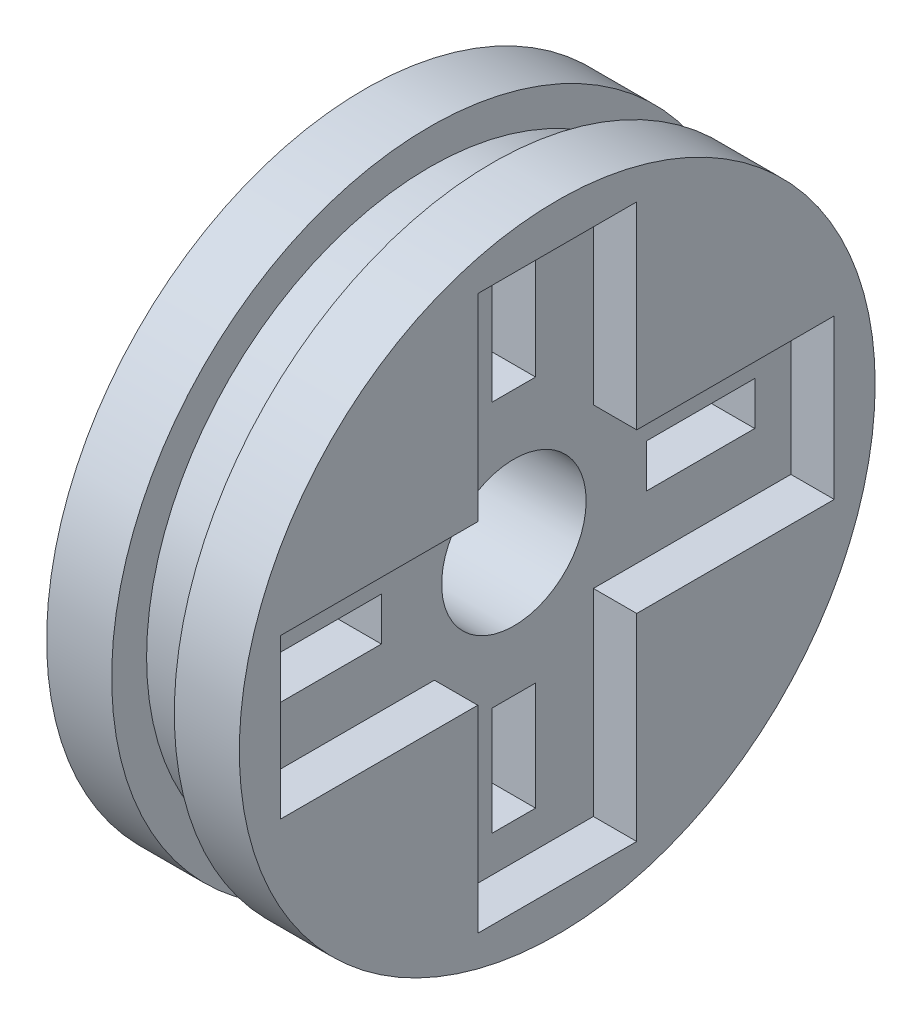
ISO-10303-21;
HEADER;
FILE_DESCRIPTION(('STEP AP214'),'2;1');
FILE_NAME('part.step','',(''),(''),'','','');
FILE_SCHEMA(('AUTOMOTIVE_DESIGN { 1 0 10303 214 1 1 1 1 }'));
ENDSEC;
DATA;
#1=APPLICATION_CONTEXT('core data for automotive mechanical design processes');
#2=APPLICATION_PROTOCOL_DEFINITION('international standard','automotive_design',2000,#1);
#3=PRODUCT_CONTEXT('',#1,'mechanical');
#4=PRODUCT('Part','Part','',(#3));
#5=PRODUCT_RELATED_PRODUCT_CATEGORY('part','',(#4));
#6=PRODUCT_DEFINITION_FORMATION('','',#4);
#7=PRODUCT_DEFINITION_CONTEXT('part definition',#1,'design');
#8=PRODUCT_DEFINITION('design','',#6,#7);
#9=PRODUCT_DEFINITION_SHAPE('','',#8);
#10=(LENGTH_UNIT() NAMED_UNIT(*) SI_UNIT(.MILLI.,.METRE.));
#11=(NAMED_UNIT(*) PLANE_ANGLE_UNIT() SI_UNIT($,.RADIAN.));
#12=(NAMED_UNIT(*) SI_UNIT($,.STERADIAN.) SOLID_ANGLE_UNIT());
#13=UNCERTAINTY_MEASURE_WITH_UNIT(LENGTH_MEASURE(1.E-05),#10,'distance_accuracy_value','');
#14=(GEOMETRIC_REPRESENTATION_CONTEXT(3) GLOBAL_UNCERTAINTY_ASSIGNED_CONTEXT((#13)) GLOBAL_UNIT_ASSIGNED_CONTEXT((#10,
#11,#12)) REPRESENTATION_CONTEXT('',''));
#15=CARTESIAN_POINT('',(0.,0.,0.));
#16=DIRECTION('',(0.,0.,1.));
#17=DIRECTION('',(1.,0.,0.));
#18=AXIS2_PLACEMENT_3D('',#15,#16,#17);
#19=CARTESIAN_POINT('',(-85.2,-65.,66.));
#20=DIRECTION('',(1.,0.,0.));
#21=DIRECTION('',(0.,0.,-1.));
#22=AXIS2_PLACEMENT_3D('',#19,#20,#21);
#23=PLANE('',#22);
#24=CARTESIAN_POINT('',(-85.2,-65.,66.));
#25=DIRECTION('',(1.,0.,0.));
#26=DIRECTION('',(0.,0.,-1.));
#27=AXIS2_PLACEMENT_3D('',#24,#25,#26);
#28=CIRCLE('',#27,3.);
#29=CARTESIAN_POINT('',(-85.2,-65.,63.));
#30=VERTEX_POINT('',#29);
#31=EDGE_CURVE('E463',#30,#30,#28,.F.);
#32=ORIENTED_EDGE('',*,*,#31,.F.);
#33=EDGE_LOOP('',(#32));
#34=FACE_BOUND('',#33,.T.);
#35=DIRECTION('',(0.,1.,0.));
#36=VECTOR('',#35,1.);
#37=CARTESIAN_POINT('',(-85.2,-65.,76.));
#38=LINE('',#37,#36);
#39=CARTESIAN_POINT('',(-85.2,-65.9,76.));
#40=VERTEX_POINT('',#39);
#41=CARTESIAN_POINT('',(-85.2,-64.1,76.));
#42=VERTEX_POINT('',#41);
#43=EDGE_CURVE('E420',#40,#42,#38,.T.);
#44=ORIENTED_EDGE('',*,*,#43,.F.);
#45=DIRECTION('',(0.,0.,1.));
#46=VECTOR('',#45,1.);
#47=CARTESIAN_POINT('',(-85.2,-65.9,66.));
#48=LINE('',#47,#46);
#49=CARTESIAN_POINT('',(-85.2,-65.9,71.5));
#50=VERTEX_POINT('',#49);
#51=EDGE_CURVE('E415',#50,#40,#48,.T.);
#52=ORIENTED_EDGE('',*,*,#51,.F.);
#53=DIRECTION('',(0.,1.,0.));
#54=VECTOR('',#53,1.);
#55=CARTESIAN_POINT('',(-85.2,-65.,71.5));
#56=LINE('',#55,#54);
#57=CARTESIAN_POINT('',(-85.2,-64.1,71.5));
#58=VERTEX_POINT('',#57);
#59=EDGE_CURVE('E422',#50,#58,#56,.T.);
#60=ORIENTED_EDGE('',*,*,#59,.T.);
#61=DIRECTION('',(0.,0.,-1.));
#62=VECTOR('',#61,1.);
#63=CARTESIAN_POINT('',(-85.2,-64.1,66.));
#64=LINE('',#63,#62);
#65=EDGE_CURVE('E417',#42,#58,#64,.T.);
#66=ORIENTED_EDGE('',*,*,#65,.F.);
#67=EDGE_LOOP('',(#44,#52,#60,#66));
#68=FACE_BOUND('',#67,.T.);
#69=DIRECTION('',(0.,1.,0.));
#70=VECTOR('',#69,1.);
#71=CARTESIAN_POINT('',(-85.2,-65.,66.9));
#72=LINE('',#71,#70);
#73=CARTESIAN_POINT('',(-85.2,-59.5,66.9));
#74=VERTEX_POINT('',#73);
#75=CARTESIAN_POINT('',(-85.2,-55.,66.9));
#76=VERTEX_POINT('',#75);
#77=EDGE_CURVE('E342',#74,#76,#72,.T.);
#78=ORIENTED_EDGE('',*,*,#77,.F.);
#79=DIRECTION('',(0.,0.,1.));
#80=VECTOR('',#79,1.);
#81=CARTESIAN_POINT('',(-85.2,-59.5,66.));
#82=LINE('',#81,#80);
#83=CARTESIAN_POINT('',(-85.2,-59.5,65.1));
#84=VERTEX_POINT('',#83);
#85=EDGE_CURVE('E334',#84,#74,#82,.T.);
#86=ORIENTED_EDGE('',*,*,#85,.F.);
#87=DIRECTION('',(0.,1.,0.));
#88=VECTOR('',#87,1.);
#89=CARTESIAN_POINT('',(-85.2,-65.,65.1));
#90=LINE('',#89,#88);
#91=CARTESIAN_POINT('',(-85.2,-55.,65.1));
#92=VERTEX_POINT('',#91);
#93=EDGE_CURVE('E344',#84,#92,#90,.T.);
#94=ORIENTED_EDGE('',*,*,#93,.T.);
#95=DIRECTION('',(0.,0.,-1.));
#96=VECTOR('',#95,1.);
#97=CARTESIAN_POINT('',(-85.2,-55.,66.));
#98=LINE('',#97,#96);
#99=EDGE_CURVE('E339',#76,#92,#98,.T.);
#100=ORIENTED_EDGE('',*,*,#99,.F.);
#101=EDGE_LOOP('',(#78,#86,#94,#100));
#102=FACE_BOUND('',#101,.T.);
#103=CARTESIAN_POINT('',(-85.2,-65.,66.));
#104=DIRECTION('',(1.,0.,0.));
#105=DIRECTION('',(0.,0.,-1.));
#106=AXIS2_PLACEMENT_3D('',#103,#104,#105);
#107=CIRCLE('',#106,13.2);
#108=CARTESIAN_POINT('',(-85.2,-65.,52.8));
#109=VERTEX_POINT('',#108);
#110=EDGE_CURVE('E306',#109,#109,#107,.T.);
#111=ORIENTED_EDGE('',*,*,#110,.F.);
#112=EDGE_LOOP('',(#111));
#113=FACE_BOUND('',#112,.T.);
#114=DIRECTION('',(0.,1.,0.));
#115=VECTOR('',#114,1.);
#116=CARTESIAN_POINT('',(-85.2,-65.,66.9));
#117=LINE('',#116,#115);
#118=CARTESIAN_POINT('',(-85.2,-75.,66.9));
#119=VERTEX_POINT('',#118);
#120=CARTESIAN_POINT('',(-85.2,-70.5,66.9));
#121=VERTEX_POINT('',#120);
#122=EDGE_CURVE('E381',#119,#121,#117,.T.);
#123=ORIENTED_EDGE('',*,*,#122,.F.);
#124=DIRECTION('',(0.,0.,1.));
#125=VECTOR('',#124,1.);
#126=CARTESIAN_POINT('',(-85.2,-75.,66.));
#127=LINE('',#126,#125);
#128=CARTESIAN_POINT('',(-85.2,-75.,65.1));
#129=VERTEX_POINT('',#128);
#130=EDGE_CURVE('E373',#129,#119,#127,.T.);
#131=ORIENTED_EDGE('',*,*,#130,.F.);
#132=DIRECTION('',(0.,1.,0.));
#133=VECTOR('',#132,1.);
#134=CARTESIAN_POINT('',(-85.2,-65.,65.1));
#135=LINE('',#134,#133);
#136=CARTESIAN_POINT('',(-85.2,-70.5,65.1));
#137=VERTEX_POINT('',#136);
#138=EDGE_CURVE('E383',#129,#137,#135,.T.);
#139=ORIENTED_EDGE('',*,*,#138,.T.);
#140=DIRECTION('',(0.,0.,-1.));
#141=VECTOR('',#140,1.);
#142=CARTESIAN_POINT('',(-85.2,-70.5,66.));
#143=LINE('',#142,#141);
#144=EDGE_CURVE('E378',#121,#137,#143,.T.);
#145=ORIENTED_EDGE('',*,*,#144,.F.);
#146=EDGE_LOOP('',(#123,#131,#139,#145));
#147=FACE_BOUND('',#146,.T.);
#148=DIRECTION('',(0.,1.,0.));
#149=VECTOR('',#148,1.);
#150=CARTESIAN_POINT('',(-85.2,-65.,60.5));
#151=LINE('',#150,#149);
#152=CARTESIAN_POINT('',(-85.2,-65.9,60.5));
#153=VERTEX_POINT('',#152);
#154=CARTESIAN_POINT('',(-85.2,-64.1,60.5));
#155=VERTEX_POINT('',#154);
#156=EDGE_CURVE('E457',#153,#155,#151,.T.);
#157=ORIENTED_EDGE('',*,*,#156,.F.);
#158=DIRECTION('',(0.,0.,1.));
#159=VECTOR('',#158,1.);
#160=CARTESIAN_POINT('',(-85.2,-65.9,66.));
#161=LINE('',#160,#159);
#162=CARTESIAN_POINT('',(-85.2,-65.9,56.));
#163=VERTEX_POINT('',#162);
#164=EDGE_CURVE('E454',#163,#153,#161,.T.);
#165=ORIENTED_EDGE('',*,*,#164,.F.);
#166=DIRECTION('',(0.,1.,0.));
#167=VECTOR('',#166,1.);
#168=CARTESIAN_POINT('',(-85.2,-65.,56.));
#169=LINE('',#168,#167);
#170=CARTESIAN_POINT('',(-85.2,-64.1,56.));
#171=VERTEX_POINT('',#170);
#172=EDGE_CURVE('E459',#163,#171,#169,.T.);
#173=ORIENTED_EDGE('',*,*,#172,.T.);
#174=DIRECTION('',(0.,0.,-1.));
#175=VECTOR('',#174,1.);
#176=CARTESIAN_POINT('',(-85.2,-64.1,66.));
#177=LINE('',#176,#175);
#178=EDGE_CURVE('E241',#155,#171,#177,.T.);
#179=ORIENTED_EDGE('',*,*,#178,.F.);
#180=EDGE_LOOP('',(#157,#165,#173,#179));
#181=FACE_BOUND('',#180,.T.);
#182=ADVANCED_FACE('F45',(#34,#68,#102,#113,#147,#181),#23,.F.);
#183=CARTESIAN_POINT('',(-79.,-65.,66.));
#184=DIRECTION('',(1.,0.,0.));
#185=DIRECTION('',(0.,0.,-1.));
#186=AXIS2_PLACEMENT_3D('',#183,#184,#185);
#187=PLANE('',#186);
#188=CARTESIAN_POINT('',(-79.,-65.,66.));
#189=DIRECTION('',(1.,0.,0.));
#190=DIRECTION('',(0.,0.,-1.));
#191=AXIS2_PLACEMENT_3D('',#188,#189,#190);
#192=CIRCLE('',#191,3.);
#193=CARTESIAN_POINT('',(-79.,-65.,63.));
#194=VERTEX_POINT('',#193);
#195=EDGE_CURVE('E49',#194,#194,#192,.F.);
#196=ORIENTED_EDGE('',*,*,#195,.T.);
#197=EDGE_LOOP('',(#196));
#198=FACE_BOUND('',#197,.T.);
#199=DIRECTION('',(0.,0.,-1.));
#200=VECTOR('',#199,1.);
#201=CARTESIAN_POINT('',(-79.,-61.7,66.));
#202=LINE('',#201,#200);
#203=CARTESIAN_POINT('',(-79.,-61.7,62.7));
#204=VERTEX_POINT('',#203);
#205=CARTESIAN_POINT('',(-79.,-61.7,54.5));
#206=VERTEX_POINT('',#205);
#207=EDGE_CURVE('E443',#204,#206,#202,.T.);
#208=ORIENTED_EDGE('',*,*,#207,.F.);
#209=DIRECTION('',(0.,-1.,0.));
#210=VECTOR('',#209,1.);
#211=CARTESIAN_POINT('',(-79.,-65.,62.7));
#212=LINE('',#211,#210);
#213=CARTESIAN_POINT('',(-79.,-53.5,62.7));
#214=VERTEX_POINT('',#213);
#215=EDGE_CURVE('E331',#214,#204,#212,.T.);
#216=ORIENTED_EDGE('',*,*,#215,.F.);
#217=DIRECTION('',(0.,0.,-1.));
#218=VECTOR('',#217,1.);
#219=CARTESIAN_POINT('',(-79.,-53.5,69.3));
#220=LINE('',#219,#218);
#221=CARTESIAN_POINT('',(-79.,-53.5,69.3));
#222=VERTEX_POINT('',#221);
#223=EDGE_CURVE('E324',#222,#214,#220,.T.);
#224=ORIENTED_EDGE('',*,*,#223,.F.);
#225=DIRECTION('',(0.,-1.,0.));
#226=VECTOR('',#225,1.);
#227=CARTESIAN_POINT('',(-79.,-65.,69.3));
#228=LINE('',#227,#226);
#229=CARTESIAN_POINT('',(-79.,-61.7,69.3));
#230=VERTEX_POINT('',#229);
#231=EDGE_CURVE('E330',#222,#230,#228,.T.);
#232=ORIENTED_EDGE('',*,*,#231,.T.);
#233=DIRECTION('',(0.,0.,-1.));
#234=VECTOR('',#233,1.);
#235=CARTESIAN_POINT('',(-79.,-61.7,77.5));
#236=LINE('',#235,#234);
#237=CARTESIAN_POINT('',(-79.,-61.7,77.5));
#238=VERTEX_POINT('',#237);
#239=EDGE_CURVE('E405',#238,#230,#236,.T.);
#240=ORIENTED_EDGE('',*,*,#239,.F.);
#241=DIRECTION('',(0.,-1.,0.));
#242=VECTOR('',#241,1.);
#243=CARTESIAN_POINT('',(-79.,-68.3,77.5));
#244=LINE('',#243,#242);
#245=CARTESIAN_POINT('',(-79.,-68.3,77.5));
#246=VERTEX_POINT('',#245);
#247=EDGE_CURVE('E412',#238,#246,#244,.T.);
#248=ORIENTED_EDGE('',*,*,#247,.T.);
#249=DIRECTION('',(0.,0.,-1.));
#250=VECTOR('',#249,1.);
#251=CARTESIAN_POINT('',(-79.,-68.3,77.5));
#252=LINE('',#251,#250);
#253=CARTESIAN_POINT('',(-79.,-68.3,69.3));
#254=VERTEX_POINT('',#253);
#255=EDGE_CURVE('E402',#246,#254,#252,.T.);
#256=ORIENTED_EDGE('',*,*,#255,.T.);
#257=DIRECTION('',(0.,-1.,0.));
#258=VECTOR('',#257,1.);
#259=CARTESIAN_POINT('',(-79.,-76.5,69.3));
#260=LINE('',#259,#258);
#261=CARTESIAN_POINT('',(-79.,-76.5,69.3));
#262=VERTEX_POINT('',#261);
#263=EDGE_CURVE('E370',#254,#262,#260,.T.);
#264=ORIENTED_EDGE('',*,*,#263,.T.);
#265=DIRECTION('',(0.,0.,-1.));
#266=VECTOR('',#265,1.);
#267=CARTESIAN_POINT('',(-79.,-76.5,69.3));
#268=LINE('',#267,#266);
#269=CARTESIAN_POINT('',(-79.,-76.5,62.7));
#270=VERTEX_POINT('',#269);
#271=EDGE_CURVE('E363',#262,#270,#268,.T.);
#272=ORIENTED_EDGE('',*,*,#271,.T.);
#273=DIRECTION('',(0.,-1.,0.));
#274=VECTOR('',#273,1.);
#275=CARTESIAN_POINT('',(-79.,-76.5,62.7));
#276=LINE('',#275,#274);
#277=CARTESIAN_POINT('',(-79.,-68.3,62.7));
#278=VERTEX_POINT('',#277);
#279=EDGE_CURVE('E371',#278,#270,#276,.T.);
#280=ORIENTED_EDGE('',*,*,#279,.F.);
#281=DIRECTION('',(0.,0.,-1.));
#282=VECTOR('',#281,1.);
#283=CARTESIAN_POINT('',(-79.,-68.3,66.));
#284=LINE('',#283,#282);
#285=CARTESIAN_POINT('',(-79.,-68.3,54.5));
#286=VERTEX_POINT('',#285);
#287=EDGE_CURVE('E441',#278,#286,#284,.T.);
#288=ORIENTED_EDGE('',*,*,#287,.T.);
#289=DIRECTION('',(0.,-1.,0.));
#290=VECTOR('',#289,1.);
#291=CARTESIAN_POINT('',(-79.,-68.3,54.5));
#292=LINE('',#291,#290);
#293=EDGE_CURVE('E451',#206,#286,#292,.T.);
#294=ORIENTED_EDGE('',*,*,#293,.F.);
#295=EDGE_LOOP('',(#208,#216,#224,#232,#240,#248,#256,#264,#272,#280,#288,#294));
#296=FACE_BOUND('',#295,.T.);
#297=DIRECTION('',(0.,0.,1.));
#298=VECTOR('',#297,1.);
#299=CARTESIAN_POINT('',(-79.,-59.5,66.));
#300=LINE('',#299,#298);
#301=CARTESIAN_POINT('',(-79.,-59.5,65.1));
#302=VERTEX_POINT('',#301);
#303=CARTESIAN_POINT('',(-79.,-59.5,66.9));
#304=VERTEX_POINT('',#303);
#305=EDGE_CURVE('E291',#302,#304,#300,.T.);
#306=ORIENTED_EDGE('',*,*,#305,.T.);
#307=DIRECTION('',(0.,1.,0.));
#308=VECTOR('',#307,1.);
#309=CARTESIAN_POINT('',(-79.,-65.,66.9));
#310=LINE('',#309,#308);
#311=CARTESIAN_POINT('',(-79.,-55.,66.9));
#312=VERTEX_POINT('',#311);
#313=EDGE_CURVE('E288',#304,#312,#310,.T.);
#314=ORIENTED_EDGE('',*,*,#313,.T.);
#315=DIRECTION('',(0.,0.,-1.));
#316=VECTOR('',#315,1.);
#317=CARTESIAN_POINT('',(-79.,-55.,66.));
#318=LINE('',#317,#316);
#319=CARTESIAN_POINT('',(-79.,-55.,65.1));
#320=VERTEX_POINT('',#319);
#321=EDGE_CURVE('E294',#312,#320,#318,.T.);
#322=ORIENTED_EDGE('',*,*,#321,.T.);
#323=DIRECTION('',(0.,1.,0.));
#324=VECTOR('',#323,1.);
#325=CARTESIAN_POINT('',(-79.,-65.,65.1));
#326=LINE('',#325,#324);
#327=EDGE_CURVE('E297',#302,#320,#326,.T.);
#328=ORIENTED_EDGE('',*,*,#327,.F.);
#329=EDGE_LOOP('',(#306,#314,#322,#328));
#330=FACE_BOUND('',#329,.T.);
#331=DIRECTION('',(0.,0.,1.));
#332=VECTOR('',#331,1.);
#333=CARTESIAN_POINT('',(-79.,-75.,66.));
#334=LINE('',#333,#332);
#335=CARTESIAN_POINT('',(-79.,-75.,65.1));
#336=VERTEX_POINT('',#335);
#337=CARTESIAN_POINT('',(-79.,-75.,66.9));
#338=VERTEX_POINT('',#337);
#339=EDGE_CURVE('E277',#336,#338,#334,.T.);
#340=ORIENTED_EDGE('',*,*,#339,.T.);
#341=DIRECTION('',(0.,1.,0.));
#342=VECTOR('',#341,1.);
#343=CARTESIAN_POINT('',(-79.,-65.,66.9));
#344=LINE('',#343,#342);
#345=CARTESIAN_POINT('',(-79.,-70.5,66.9));
#346=VERTEX_POINT('',#345);
#347=EDGE_CURVE('E274',#338,#346,#344,.T.);
#348=ORIENTED_EDGE('',*,*,#347,.T.);
#349=DIRECTION('',(0.,0.,-1.));
#350=VECTOR('',#349,1.);
#351=CARTESIAN_POINT('',(-79.,-70.5,66.));
#352=LINE('',#351,#350);
#353=CARTESIAN_POINT('',(-79.,-70.5,65.1));
#354=VERTEX_POINT('',#353);
#355=EDGE_CURVE('E280',#346,#354,#352,.T.);
#356=ORIENTED_EDGE('',*,*,#355,.T.);
#357=DIRECTION('',(0.,1.,0.));
#358=VECTOR('',#357,1.);
#359=CARTESIAN_POINT('',(-79.,-65.,65.1));
#360=LINE('',#359,#358);
#361=EDGE_CURVE('E283',#336,#354,#360,.T.);
#362=ORIENTED_EDGE('',*,*,#361,.F.);
#363=EDGE_LOOP('',(#340,#348,#356,#362));
#364=FACE_BOUND('',#363,.T.);
#365=DIRECTION('',(0.,0.,1.));
#366=VECTOR('',#365,1.);
#367=CARTESIAN_POINT('',(-79.,-65.9,66.));
#368=LINE('',#367,#366);
#369=CARTESIAN_POINT('',(-79.,-65.9,71.5));
#370=VERTEX_POINT('',#369);
#371=CARTESIAN_POINT('',(-79.,-65.9,76.));
#372=VERTEX_POINT('',#371);
#373=EDGE_CURVE('E257',#370,#372,#368,.T.);
#374=ORIENTED_EDGE('',*,*,#373,.T.);
#375=DIRECTION('',(0.,1.,0.));
#376=VECTOR('',#375,1.);
#377=CARTESIAN_POINT('',(-79.,-65.,76.));
#378=LINE('',#377,#376);
#379=CARTESIAN_POINT('',(-79.,-64.1,76.));
#380=VERTEX_POINT('',#379);
#381=EDGE_CURVE('E254',#372,#380,#378,.T.);
#382=ORIENTED_EDGE('',*,*,#381,.T.);
#383=DIRECTION('',(0.,0.,-1.));
#384=VECTOR('',#383,1.);
#385=CARTESIAN_POINT('',(-79.,-64.1,66.));
#386=LINE('',#385,#384);
#387=CARTESIAN_POINT('',(-79.,-64.1,71.5));
#388=VERTEX_POINT('',#387);
#389=EDGE_CURVE('E260',#380,#388,#386,.T.);
#390=ORIENTED_EDGE('',*,*,#389,.T.);
#391=DIRECTION('',(0.,1.,0.));
#392=VECTOR('',#391,1.);
#393=CARTESIAN_POINT('',(-79.,-65.,71.5));
#394=LINE('',#393,#392);
#395=EDGE_CURVE('E263',#370,#388,#394,.T.);
#396=ORIENTED_EDGE('',*,*,#395,.F.);
#397=EDGE_LOOP('',(#374,#382,#390,#396));
#398=FACE_BOUND('',#397,.T.);
#399=DIRECTION('',(0.,0.,1.));
#400=VECTOR('',#399,1.);
#401=CARTESIAN_POINT('',(-79.,-65.9,66.));
#402=LINE('',#401,#400);
#403=CARTESIAN_POINT('',(-79.,-65.9,56.));
#404=VERTEX_POINT('',#403);
#405=CARTESIAN_POINT('',(-79.,-65.9,60.5));
#406=VERTEX_POINT('',#405);
#407=EDGE_CURVE('E54',#404,#406,#402,.T.);
#408=ORIENTED_EDGE('',*,*,#407,.T.);
#409=DIRECTION('',(0.,1.,0.));
#410=VECTOR('',#409,1.);
#411=CARTESIAN_POINT('',(-79.,-65.,60.5));
#412=LINE('',#411,#410);
#413=CARTESIAN_POINT('',(-79.,-64.1,60.5));
#414=VERTEX_POINT('',#413);
#415=EDGE_CURVE('E11',#406,#414,#412,.T.);
#416=ORIENTED_EDGE('',*,*,#415,.T.);
#417=DIRECTION('',(0.,0.,-1.));
#418=VECTOR('',#417,1.);
#419=CARTESIAN_POINT('',(-79.,-64.1,66.));
#420=LINE('',#419,#418);
#421=CARTESIAN_POINT('',(-79.,-64.1,56.));
#422=VERTEX_POINT('',#421);
#423=EDGE_CURVE('E233',#414,#422,#420,.T.);
#424=ORIENTED_EDGE('',*,*,#423,.T.);
#425=DIRECTION('',(0.,1.,0.));
#426=VECTOR('',#425,1.);
#427=CARTESIAN_POINT('',(-79.,-65.,56.));
#428=LINE('',#427,#426);
#429=EDGE_CURVE('E228',#404,#422,#428,.T.);
#430=ORIENTED_EDGE('',*,*,#429,.F.);
#431=EDGE_LOOP('',(#408,#416,#424,#430));
#432=FACE_BOUND('',#431,.T.);
#433=ADVANCED_FACE('F245',(#198,#296,#330,#364,#398,#432),#187,.T.);
#434=CARTESIAN_POINT('',(-77.2,-65.,66.));
#435=DIRECTION('',(1.,0.,0.));
#436=DIRECTION('',(0.,0.,-1.));
#437=AXIS2_PLACEMENT_3D('',#434,#435,#436);
#438=PLANE('',#437);
#439=CARTESIAN_POINT('',(-77.2,-65.,66.));
#440=DIRECTION('',(1.,0.,0.));
#441=DIRECTION('',(0.,0.,-1.));
#442=AXIS2_PLACEMENT_3D('',#439,#440,#441);
#443=CIRCLE('',#442,13.2);
#444=CARTESIAN_POINT('',(-77.2,-65.,52.8));
#445=VERTEX_POINT('',#444);
#446=EDGE_CURVE('E314',#445,#445,#443,.T.);
#447=ORIENTED_EDGE('',*,*,#446,.T.);
#448=EDGE_LOOP('',(#447));
#449=FACE_BOUND('',#448,.T.);
#450=DIRECTION('',(0.,1.,0.));
#451=VECTOR('',#450,1.);
#452=CARTESIAN_POINT('',(-77.2,-65.,54.5));
#453=LINE('',#452,#451);
#454=CARTESIAN_POINT('',(-77.2,-68.3,54.5));
#455=VERTEX_POINT('',#454);
#456=CARTESIAN_POINT('',(-77.2,-61.7,54.5));
#457=VERTEX_POINT('',#456);
#458=EDGE_CURVE('E234',#455,#457,#453,.T.);
#459=ORIENTED_EDGE('',*,*,#458,.F.);
#460=DIRECTION('',(0.,0.,1.));
#461=VECTOR('',#460,1.);
#462=CARTESIAN_POINT('',(-77.2,-68.3,66.));
#463=LINE('',#462,#461);
#464=CARTESIAN_POINT('',(-77.2,-68.3,62.7));
#465=VERTEX_POINT('',#464);
#466=EDGE_CURVE('E438',#455,#465,#463,.T.);
#467=ORIENTED_EDGE('',*,*,#466,.T.);
#468=DIRECTION('',(0.,1.,0.));
#469=VECTOR('',#468,1.);
#470=CARTESIAN_POINT('',(-77.2,-65.,62.7));
#471=LINE('',#470,#469);
#472=CARTESIAN_POINT('',(-77.2,-76.5,62.7));
#473=VERTEX_POINT('',#472);
#474=EDGE_CURVE('E360',#473,#465,#471,.T.);
#475=ORIENTED_EDGE('',*,*,#474,.F.);
#476=DIRECTION('',(0.,0.,1.));
#477=VECTOR('',#476,1.);
#478=CARTESIAN_POINT('',(-77.2,-76.5,66.));
#479=LINE('',#478,#477);
#480=CARTESIAN_POINT('',(-77.2,-76.5,69.3));
#481=VERTEX_POINT('',#480);
#482=EDGE_CURVE('E285',#473,#481,#479,.T.);
#483=ORIENTED_EDGE('',*,*,#482,.T.);
#484=DIRECTION('',(0.,1.,0.));
#485=VECTOR('',#484,1.);
#486=CARTESIAN_POINT('',(-77.2,-65.,69.3));
#487=LINE('',#486,#485);
#488=CARTESIAN_POINT('',(-77.2,-68.3,69.3));
#489=VERTEX_POINT('',#488);
#490=EDGE_CURVE('E353',#481,#489,#487,.T.);
#491=ORIENTED_EDGE('',*,*,#490,.T.);
#492=DIRECTION('',(0.,0.,1.));
#493=VECTOR('',#492,1.);
#494=CARTESIAN_POINT('',(-77.2,-68.3,66.));
#495=LINE('',#494,#493);
#496=CARTESIAN_POINT('',(-77.2,-68.3,77.5));
#497=VERTEX_POINT('',#496);
#498=EDGE_CURVE('E399',#489,#497,#495,.T.);
#499=ORIENTED_EDGE('',*,*,#498,.T.);
#500=DIRECTION('',(0.,1.,0.));
#501=VECTOR('',#500,1.);
#502=CARTESIAN_POINT('',(-77.2,-65.,77.5));
#503=LINE('',#502,#501);
#504=CARTESIAN_POINT('',(-77.2,-61.7,77.5));
#505=VERTEX_POINT('',#504);
#506=EDGE_CURVE('E265',#497,#505,#503,.T.);
#507=ORIENTED_EDGE('',*,*,#506,.T.);
#508=DIRECTION('',(0.,0.,-1.));
#509=VECTOR('',#508,1.);
#510=CARTESIAN_POINT('',(-77.2,-61.7,66.));
#511=LINE('',#510,#509);
#512=CARTESIAN_POINT('',(-77.2,-61.7,69.3));
#513=VERTEX_POINT('',#512);
#514=EDGE_CURVE('E392',#505,#513,#511,.T.);
#515=ORIENTED_EDGE('',*,*,#514,.T.);
#516=DIRECTION('',(0.,1.,0.));
#517=VECTOR('',#516,1.);
#518=CARTESIAN_POINT('',(-77.2,-65.,69.3));
#519=LINE('',#518,#517);
#520=CARTESIAN_POINT('',(-77.2,-53.5,69.3));
#521=VERTEX_POINT('',#520);
#522=EDGE_CURVE('E320',#513,#521,#519,.T.);
#523=ORIENTED_EDGE('',*,*,#522,.T.);
#524=DIRECTION('',(0.,0.,-1.));
#525=VECTOR('',#524,1.);
#526=CARTESIAN_POINT('',(-77.2,-53.5,66.));
#527=LINE('',#526,#525);
#528=CARTESIAN_POINT('',(-77.2,-53.5,62.7));
#529=VERTEX_POINT('',#528);
#530=EDGE_CURVE('E299',#521,#529,#527,.T.);
#531=ORIENTED_EDGE('',*,*,#530,.T.);
#532=DIRECTION('',(0.,1.,0.));
#533=VECTOR('',#532,1.);
#534=CARTESIAN_POINT('',(-77.2,-65.,62.7));
#535=LINE('',#534,#533);
#536=CARTESIAN_POINT('',(-77.2,-61.7,62.7));
#537=VERTEX_POINT('',#536);
#538=EDGE_CURVE('E322',#537,#529,#535,.T.);
#539=ORIENTED_EDGE('',*,*,#538,.F.);
#540=DIRECTION('',(0.,0.,-1.));
#541=VECTOR('',#540,1.);
#542=CARTESIAN_POINT('',(-77.2,-61.7,66.));
#543=LINE('',#542,#541);
#544=EDGE_CURVE('E431',#537,#457,#543,.T.);
#545=ORIENTED_EDGE('',*,*,#544,.T.);
#546=EDGE_LOOP('',(#459,#467,#475,#483,#491,#499,#507,#515,#523,#531,#539,#545));
#547=FACE_BOUND('',#546,.T.);
#548=ADVANCED_FACE('F488',(#449,#547),#438,.T.);
#549=CARTESIAN_POINT('',(0.,0.,62.7));
#550=DIRECTION('',(0.,0.,-1.));
#551=DIRECTION('',(-1.,0.,0.));
#552=AXIS2_PLACEMENT_3D('',#549,#550,#551);
#553=PLANE('',#552);
#554=DIRECTION('',(-1.,0.,0.));
#555=VECTOR('',#554,1.);
#556=CARTESIAN_POINT('',(0.,-61.7,62.7));
#557=LINE('',#556,#555);
#558=EDGE_CURVE('E250',#537,#204,#557,.T.);
#559=ORIENTED_EDGE('',*,*,#558,.F.);
#560=ORIENTED_EDGE('',*,*,#538,.T.);
#561=DIRECTION('',(-1.,0.,0.));
#562=VECTOR('',#561,1.);
#563=CARTESIAN_POINT('',(-79.,-53.5,62.7));
#564=LINE('',#563,#562);
#565=EDGE_CURVE('E328',#529,#214,#564,.T.);
#566=ORIENTED_EDGE('',*,*,#565,.T.);
#567=ORIENTED_EDGE('',*,*,#215,.T.);
#568=EDGE_LOOP('',(#559,#560,#566,#567));
#569=FACE_BOUND('',#568,.T.);
#570=ADVANCED_FACE('F510',(#569),#553,.F.);
#571=CARTESIAN_POINT('',(0.,0.,62.7));
#572=DIRECTION('',(0.,0.,-1.));
#573=DIRECTION('',(-1.,0.,0.));
#574=AXIS2_PLACEMENT_3D('',#571,#572,#573);
#575=PLANE('',#574);
#576=DIRECTION('',(1.,0.,0.));
#577=VECTOR('',#576,1.);
#578=CARTESIAN_POINT('',(0.,-68.3,62.7));
#579=LINE('',#578,#577);
#580=EDGE_CURVE('E252',#278,#465,#579,.T.);
#581=ORIENTED_EDGE('',*,*,#580,.F.);
#582=ORIENTED_EDGE('',*,*,#279,.T.);
#583=DIRECTION('',(1.,0.,0.));
#584=VECTOR('',#583,1.);
#585=CARTESIAN_POINT('',(-79.,-76.5,62.7));
#586=LINE('',#585,#584);
#587=EDGE_CURVE('E367',#270,#473,#586,.T.);
#588=ORIENTED_EDGE('',*,*,#587,.T.);
#589=ORIENTED_EDGE('',*,*,#474,.T.);
#590=EDGE_LOOP('',(#581,#582,#588,#589));
#591=FACE_BOUND('',#590,.T.);
#592=ADVANCED_FACE('F519',(#591),#575,.F.);
#593=CARTESIAN_POINT('',(0.,0.,69.3));
#594=DIRECTION('',(0.,0.,-1.));
#595=DIRECTION('',(-1.,0.,0.));
#596=AXIS2_PLACEMENT_3D('',#593,#594,#595);
#597=PLANE('',#596);
#598=ORIENTED_EDGE('',*,*,#522,.F.);
#599=DIRECTION('',(-1.,0.,0.));
#600=VECTOR('',#599,1.);
#601=CARTESIAN_POINT('',(0.,-61.7,69.3));
#602=LINE('',#601,#600);
#603=EDGE_CURVE('E268',#513,#230,#602,.T.);
#604=ORIENTED_EDGE('',*,*,#603,.T.);
#605=ORIENTED_EDGE('',*,*,#231,.F.);
#606=DIRECTION('',(-1.,0.,0.));
#607=VECTOR('',#606,1.);
#608=CARTESIAN_POINT('',(-79.,-53.5,69.3));
#609=LINE('',#608,#607);
#610=EDGE_CURVE('E327',#521,#222,#609,.T.);
#611=ORIENTED_EDGE('',*,*,#610,.F.);
#612=EDGE_LOOP('',(#598,#604,#605,#611));
#613=FACE_BOUND('',#612,.T.);
#614=ADVANCED_FACE('F521',(#613),#597,.T.);
#615=CARTESIAN_POINT('',(0.,0.,69.3));
#616=DIRECTION('',(0.,0.,-1.));
#617=DIRECTION('',(-1.,0.,0.));
#618=AXIS2_PLACEMENT_3D('',#615,#616,#617);
#619=PLANE('',#618);
#620=ORIENTED_EDGE('',*,*,#263,.F.);
#621=DIRECTION('',(1.,0.,0.));
#622=VECTOR('',#621,1.);
#623=CARTESIAN_POINT('',(0.,-68.3,69.3));
#624=LINE('',#623,#622);
#625=EDGE_CURVE('E271',#254,#489,#624,.T.);
#626=ORIENTED_EDGE('',*,*,#625,.T.);
#627=ORIENTED_EDGE('',*,*,#490,.F.);
#628=DIRECTION('',(1.,0.,0.));
#629=VECTOR('',#628,1.);
#630=CARTESIAN_POINT('',(-79.,-76.5,69.3));
#631=LINE('',#630,#629);
#632=EDGE_CURVE('E366',#262,#481,#631,.T.);
#633=ORIENTED_EDGE('',*,*,#632,.F.);
#634=EDGE_LOOP('',(#620,#626,#627,#633));
#635=FACE_BOUND('',#634,.T.);
#636=ADVANCED_FACE('F524',(#635),#619,.T.);
#637=CARTESIAN_POINT('',(-77.2,-65.,66.));
#638=DIRECTION('',(-1.,0.,0.));
#639=DIRECTION('',(0.,0.,1.));
#640=AXIS2_PLACEMENT_3D('',#637,#638,#639);
#641=CYLINDRICAL_SURFACE('',#640,13.2);
#642=ORIENTED_EDGE('',*,*,#110,.T.);
#643=EDGE_LOOP('',(#642));
#644=FACE_BOUND('',#643,.T.);
#645=CARTESIAN_POINT('',(-82.5,-65.,66.));
#646=DIRECTION('',(1.,0.,0.));
#647=DIRECTION('',(0.,0.,-1.));
#648=AXIS2_PLACEMENT_3D('',#645,#646,#647);
#649=CIRCLE('',#648,13.2);
#650=CARTESIAN_POINT('',(-82.5,-65.,52.8));
#651=VERTEX_POINT('',#650);
#652=EDGE_CURVE('E303',#651,#651,#649,.T.);
#653=ORIENTED_EDGE('',*,*,#652,.F.);
#654=EDGE_LOOP('',(#653));
#655=FACE_BOUND('',#654,.T.);
#656=ADVANCED_FACE('F47',(#644,#655),#641,.T.);
#657=CARTESIAN_POINT('',(-82.5,-65.,66.));
#658=DIRECTION('',(1.,0.,0.));
#659=DIRECTION('',(0.,0.,-1.));
#660=AXIS2_PLACEMENT_3D('',#657,#658,#659);
#661=PLANE('',#660);
#662=CARTESIAN_POINT('',(-82.5,-65.,66.));
#663=DIRECTION('',(1.,0.,0.));
#664=DIRECTION('',(0.,0.,-1.));
#665=AXIS2_PLACEMENT_3D('',#662,#663,#664);
#666=CIRCLE('',#665,11.75);
#667=CARTESIAN_POINT('',(-82.5,-65.,54.25));
#668=VERTEX_POINT('',#667);
#669=EDGE_CURVE('E302',#668,#668,#666,.T.);
#670=ORIENTED_EDGE('',*,*,#669,.F.);
#671=EDGE_LOOP('',(#670));
#672=FACE_BOUND('',#671,.T.);
#673=ORIENTED_EDGE('',*,*,#652,.T.);
#674=EDGE_LOOP('',(#673));
#675=FACE_BOUND('',#674,.T.);
#676=ADVANCED_FACE('F492',(#672,#675),#661,.T.);
#677=CARTESIAN_POINT('',(-79.9,-65.,66.));
#678=DIRECTION('',(-1.,0.,0.));
#679=DIRECTION('',(0.,0.,1.));
#680=AXIS2_PLACEMENT_3D('',#677,#678,#679);
#681=CYLINDRICAL_SURFACE('',#680,11.75);
#682=CARTESIAN_POINT('',(-79.9,-65.,66.));
#683=DIRECTION('',(1.,0.,0.));
#684=DIRECTION('',(0.,0.,-1.));
#685=AXIS2_PLACEMENT_3D('',#682,#683,#684);
#686=CIRCLE('',#685,11.75);
#687=CARTESIAN_POINT('',(-79.9,-65.,54.25));
#688=VERTEX_POINT('',#687);
#689=EDGE_CURVE('E307',#688,#688,#686,.T.);
#690=ORIENTED_EDGE('',*,*,#689,.F.);
#691=EDGE_LOOP('',(#690));
#692=FACE_BOUND('',#691,.T.);
#693=ORIENTED_EDGE('',*,*,#669,.T.);
#694=EDGE_LOOP('',(#693));
#695=FACE_BOUND('',#694,.T.);
#696=ADVANCED_FACE('F495',(#692,#695),#681,.T.);
#697=CARTESIAN_POINT('',(-77.2,-65.,66.));
#698=DIRECTION('',(-1.,0.,0.));
#699=DIRECTION('',(0.,0.,1.));
#700=AXIS2_PLACEMENT_3D('',#697,#698,#699);
#701=CYLINDRICAL_SURFACE('',#700,13.2);
#702=CARTESIAN_POINT('',(-79.9,-65.,66.));
#703=DIRECTION('',(1.,0.,0.));
#704=DIRECTION('',(0.,0.,-1.));
#705=AXIS2_PLACEMENT_3D('',#702,#703,#704);
#706=CIRCLE('',#705,13.2);
#707=CARTESIAN_POINT('',(-79.9,-65.,52.8));
#708=VERTEX_POINT('',#707);
#709=EDGE_CURVE('E317',#708,#708,#706,.T.);
#710=ORIENTED_EDGE('',*,*,#709,.T.);
#711=EDGE_LOOP('',(#710));
#712=FACE_BOUND('',#711,.T.);
#713=ORIENTED_EDGE('',*,*,#446,.F.);
#714=EDGE_LOOP('',(#713));
#715=FACE_BOUND('',#714,.T.);
#716=ADVANCED_FACE('F499',(#712,#715),#701,.T.);
#717=CARTESIAN_POINT('',(-79.9,-65.,66.));
#718=DIRECTION('',(1.,0.,0.));
#719=DIRECTION('',(0.,0.,-1.));
#720=AXIS2_PLACEMENT_3D('',#717,#718,#719);
#721=PLANE('',#720);
#722=ORIENTED_EDGE('',*,*,#689,.T.);
#723=EDGE_LOOP('',(#722));
#724=FACE_BOUND('',#723,.T.);
#725=ORIENTED_EDGE('',*,*,#709,.F.);
#726=EDGE_LOOP('',(#725));
#727=FACE_BOUND('',#726,.T.);
#728=ADVANCED_FACE('F503',(#724,#727),#721,.F.);
#729=CARTESIAN_POINT('',(-79.,-53.5,69.3));
#730=DIRECTION('',(0.,-1.,0.));
#731=DIRECTION('',(0.,0.,-1.));
#732=AXIS2_PLACEMENT_3D('',#729,#730,#731);
#733=PLANE('',#732);
#734=ORIENTED_EDGE('',*,*,#610,.T.);
#735=ORIENTED_EDGE('',*,*,#223,.T.);
#736=ORIENTED_EDGE('',*,*,#565,.F.);
#737=ORIENTED_EDGE('',*,*,#530,.F.);
#738=EDGE_LOOP('',(#734,#735,#736,#737));
#739=FACE_BOUND('',#738,.T.);
#740=ADVANCED_FACE('F507',(#739),#733,.T.);
#741=CARTESIAN_POINT('',(-86.2,-59.5,66.9));
#742=DIRECTION('',(0.,1.,0.));
#743=DIRECTION('',(0.,0.,1.));
#744=AXIS2_PLACEMENT_3D('',#741,#742,#743);
#745=PLANE('',#744);
#746=ORIENTED_EDGE('',*,*,#85,.T.);
#747=DIRECTION('',(1.,0.,0.));
#748=VECTOR('',#747,1.);
#749=CARTESIAN_POINT('',(-86.2,-59.5,66.9));
#750=LINE('',#749,#748);
#751=EDGE_CURVE('E350',#74,#304,#750,.T.);
#752=ORIENTED_EDGE('',*,*,#751,.T.);
#753=ORIENTED_EDGE('',*,*,#305,.F.);
#754=DIRECTION('',(1.,0.,0.));
#755=VECTOR('',#754,1.);
#756=CARTESIAN_POINT('',(-86.2,-59.5,65.1));
#757=LINE('',#756,#755);
#758=EDGE_CURVE('E351',#84,#302,#757,.T.);
#759=ORIENTED_EDGE('',*,*,#758,.F.);
#760=EDGE_LOOP('',(#746,#752,#753,#759));
#761=FACE_BOUND('',#760,.T.);
#762=ADVANCED_FACE('F515',(#761),#745,.T.);
#763=CARTESIAN_POINT('',(-86.2,-55.,66.9));
#764=DIRECTION('',(0.,-1.,0.));
#765=DIRECTION('',(0.,0.,-1.));
#766=AXIS2_PLACEMENT_3D('',#763,#764,#765);
#767=PLANE('',#766);
#768=ORIENTED_EDGE('',*,*,#99,.T.);
#769=DIRECTION('',(-1.,0.,0.));
#770=VECTOR('',#769,1.);
#771=CARTESIAN_POINT('',(-86.2,-55.,65.1));
#772=LINE('',#771,#770);
#773=EDGE_CURVE('E348',#320,#92,#772,.T.);
#774=ORIENTED_EDGE('',*,*,#773,.F.);
#775=ORIENTED_EDGE('',*,*,#321,.F.);
#776=DIRECTION('',(-1.,0.,0.));
#777=VECTOR('',#776,1.);
#778=CARTESIAN_POINT('',(-86.2,-55.,66.9));
#779=LINE('',#778,#777);
#780=EDGE_CURVE('E347',#312,#76,#779,.T.);
#781=ORIENTED_EDGE('',*,*,#780,.T.);
#782=EDGE_LOOP('',(#768,#774,#775,#781));
#783=FACE_BOUND('',#782,.T.);
#784=ADVANCED_FACE('F528',(#783),#767,.T.);
#785=CARTESIAN_POINT('',(0.,0.,66.9));
#786=DIRECTION('',(0.,0.,-1.));
#787=DIRECTION('',(-1.,0.,0.));
#788=AXIS2_PLACEMENT_3D('',#785,#786,#787);
#789=PLANE('',#788);
#790=ORIENTED_EDGE('',*,*,#77,.T.);
#791=ORIENTED_EDGE('',*,*,#780,.F.);
#792=ORIENTED_EDGE('',*,*,#313,.F.);
#793=ORIENTED_EDGE('',*,*,#751,.F.);
#794=EDGE_LOOP('',(#790,#791,#792,#793));
#795=FACE_BOUND('',#794,.T.);
#796=ADVANCED_FACE('F532',(#795),#789,.T.);
#797=CARTESIAN_POINT('',(0.,0.,65.1));
#798=DIRECTION('',(0.,0.,-1.));
#799=DIRECTION('',(-1.,0.,0.));
#800=AXIS2_PLACEMENT_3D('',#797,#798,#799);
#801=PLANE('',#800);
#802=ORIENTED_EDGE('',*,*,#758,.T.);
#803=ORIENTED_EDGE('',*,*,#327,.T.);
#804=ORIENTED_EDGE('',*,*,#773,.T.);
#805=ORIENTED_EDGE('',*,*,#93,.F.);
#806=EDGE_LOOP('',(#802,#803,#804,#805));
#807=FACE_BOUND('',#806,.T.);
#808=ADVANCED_FACE('F534',(#807),#801,.F.);
#809=CARTESIAN_POINT('',(-79.,-76.5,69.3));
#810=DIRECTION('',(0.,1.,0.));
#811=DIRECTION('',(0.,0.,1.));
#812=AXIS2_PLACEMENT_3D('',#809,#810,#811);
#813=PLANE('',#812);
#814=ORIENTED_EDGE('',*,*,#587,.F.);
#815=ORIENTED_EDGE('',*,*,#271,.F.);
#816=ORIENTED_EDGE('',*,*,#632,.T.);
#817=ORIENTED_EDGE('',*,*,#482,.F.);
#818=EDGE_LOOP('',(#814,#815,#816,#817));
#819=FACE_BOUND('',#818,.T.);
#820=ADVANCED_FACE('F537',(#819),#813,.T.);
#821=CARTESIAN_POINT('',(-86.2,-75.,66.9));
#822=DIRECTION('',(0.,1.,0.));
#823=DIRECTION('',(0.,0.,1.));
#824=AXIS2_PLACEMENT_3D('',#821,#822,#823);
#825=PLANE('',#824);
#826=ORIENTED_EDGE('',*,*,#130,.T.);
#827=DIRECTION('',(1.,0.,0.));
#828=VECTOR('',#827,1.);
#829=CARTESIAN_POINT('',(-86.2,-75.,66.9));
#830=LINE('',#829,#828);
#831=EDGE_CURVE('E389',#119,#338,#830,.T.);
#832=ORIENTED_EDGE('',*,*,#831,.T.);
#833=ORIENTED_EDGE('',*,*,#339,.F.);
#834=DIRECTION('',(1.,0.,0.));
#835=VECTOR('',#834,1.);
#836=CARTESIAN_POINT('',(-86.2,-75.,65.1));
#837=LINE('',#836,#835);
#838=EDGE_CURVE('E390',#129,#336,#837,.T.);
#839=ORIENTED_EDGE('',*,*,#838,.F.);
#840=EDGE_LOOP('',(#826,#832,#833,#839));
#841=FACE_BOUND('',#840,.T.);
#842=ADVANCED_FACE('F544',(#841),#825,.T.);
#843=CARTESIAN_POINT('',(-86.2,-70.5,66.9));
#844=DIRECTION('',(0.,-1.,0.));
#845=DIRECTION('',(0.,0.,-1.));
#846=AXIS2_PLACEMENT_3D('',#843,#844,#845);
#847=PLANE('',#846);
#848=ORIENTED_EDGE('',*,*,#144,.T.);
#849=DIRECTION('',(-1.,0.,0.));
#850=VECTOR('',#849,1.);
#851=CARTESIAN_POINT('',(-86.2,-70.5,65.1));
#852=LINE('',#851,#850);
#853=EDGE_CURVE('E387',#354,#137,#852,.T.);
#854=ORIENTED_EDGE('',*,*,#853,.F.);
#855=ORIENTED_EDGE('',*,*,#355,.F.);
#856=DIRECTION('',(-1.,0.,0.));
#857=VECTOR('',#856,1.);
#858=CARTESIAN_POINT('',(-86.2,-70.5,66.9));
#859=LINE('',#858,#857);
#860=EDGE_CURVE('E386',#346,#121,#859,.T.);
#861=ORIENTED_EDGE('',*,*,#860,.T.);
#862=EDGE_LOOP('',(#848,#854,#855,#861));
#863=FACE_BOUND('',#862,.T.);
#864=ADVANCED_FACE('F554',(#863),#847,.T.);
#865=CARTESIAN_POINT('',(0.,0.,66.9));
#866=DIRECTION('',(0.,0.,-1.));
#867=DIRECTION('',(-1.,0.,0.));
#868=AXIS2_PLACEMENT_3D('',#865,#866,#867);
#869=PLANE('',#868);
#870=ORIENTED_EDGE('',*,*,#122,.T.);
#871=ORIENTED_EDGE('',*,*,#860,.F.);
#872=ORIENTED_EDGE('',*,*,#347,.F.);
#873=ORIENTED_EDGE('',*,*,#831,.F.);
#874=EDGE_LOOP('',(#870,#871,#872,#873));
#875=FACE_BOUND('',#874,.T.);
#876=ADVANCED_FACE('F558',(#875),#869,.T.);
#877=CARTESIAN_POINT('',(0.,0.,65.1));
#878=DIRECTION('',(0.,0.,-1.));
#879=DIRECTION('',(-1.,0.,0.));
#880=AXIS2_PLACEMENT_3D('',#877,#878,#879);
#881=PLANE('',#880);
#882=ORIENTED_EDGE('',*,*,#838,.T.);
#883=ORIENTED_EDGE('',*,*,#361,.T.);
#884=ORIENTED_EDGE('',*,*,#853,.T.);
#885=ORIENTED_EDGE('',*,*,#138,.F.);
#886=EDGE_LOOP('',(#882,#883,#884,#885));
#887=FACE_BOUND('',#886,.T.);
#888=ADVANCED_FACE('F560',(#887),#881,.F.);
#889=CARTESIAN_POINT('',(-79.,-68.3,77.5));
#890=DIRECTION('',(0.,1.,0.));
#891=DIRECTION('',(0.,0.,1.));
#892=AXIS2_PLACEMENT_3D('',#889,#890,#891);
#893=PLANE('',#892);
#894=ORIENTED_EDGE('',*,*,#625,.F.);
#895=ORIENTED_EDGE('',*,*,#255,.F.);
#896=DIRECTION('',(1.,0.,0.));
#897=VECTOR('',#896,1.);
#898=CARTESIAN_POINT('',(-79.,-68.3,77.5));
#899=LINE('',#898,#897);
#900=EDGE_CURVE('E409',#246,#497,#899,.T.);
#901=ORIENTED_EDGE('',*,*,#900,.T.);
#902=ORIENTED_EDGE('',*,*,#498,.F.);
#903=EDGE_LOOP('',(#894,#895,#901,#902));
#904=FACE_BOUND('',#903,.T.);
#905=ADVANCED_FACE('F563',(#904),#893,.T.);
#906=CARTESIAN_POINT('',(-79.,-61.7,77.5));
#907=DIRECTION('',(0.,-1.,0.));
#908=DIRECTION('',(0.,0.,-1.));
#909=AXIS2_PLACEMENT_3D('',#906,#907,#908);
#910=PLANE('',#909);
#911=DIRECTION('',(-1.,0.,0.));
#912=VECTOR('',#911,1.);
#913=CARTESIAN_POINT('',(-79.,-61.7,77.5));
#914=LINE('',#913,#912);
#915=EDGE_CURVE('E407',#505,#238,#914,.T.);
#916=ORIENTED_EDGE('',*,*,#915,.T.);
#917=ORIENTED_EDGE('',*,*,#239,.T.);
#918=ORIENTED_EDGE('',*,*,#603,.F.);
#919=ORIENTED_EDGE('',*,*,#514,.F.);
#920=EDGE_LOOP('',(#916,#917,#918,#919));
#921=FACE_BOUND('',#920,.T.);
#922=ADVANCED_FACE('F570',(#921),#910,.T.);
#923=CARTESIAN_POINT('',(0.,0.,77.5));
#924=DIRECTION('',(0.,0.,-1.));
#925=DIRECTION('',(-1.,0.,0.));
#926=AXIS2_PLACEMENT_3D('',#923,#924,#925);
#927=PLANE('',#926);
#928=ORIENTED_EDGE('',*,*,#900,.F.);
#929=ORIENTED_EDGE('',*,*,#247,.F.);
#930=ORIENTED_EDGE('',*,*,#915,.F.);
#931=ORIENTED_EDGE('',*,*,#506,.F.);
#932=EDGE_LOOP('',(#928,#929,#930,#931));
#933=FACE_BOUND('',#932,.T.);
#934=ADVANCED_FACE('F574',(#933),#927,.T.);
#935=CARTESIAN_POINT('',(-86.2,-65.9,76.));
#936=DIRECTION('',(0.,1.,0.));
#937=DIRECTION('',(0.,0.,1.));
#938=AXIS2_PLACEMENT_3D('',#935,#936,#937);
#939=PLANE('',#938);
#940=ORIENTED_EDGE('',*,*,#51,.T.);
#941=DIRECTION('',(1.,0.,0.));
#942=VECTOR('',#941,1.);
#943=CARTESIAN_POINT('',(-86.2,-65.9,76.));
#944=LINE('',#943,#942);
#945=EDGE_CURVE('E428',#40,#372,#944,.T.);
#946=ORIENTED_EDGE('',*,*,#945,.T.);
#947=ORIENTED_EDGE('',*,*,#373,.F.);
#948=DIRECTION('',(1.,0.,0.));
#949=VECTOR('',#948,1.);
#950=CARTESIAN_POINT('',(-86.2,-65.9,71.5));
#951=LINE('',#950,#949);
#952=EDGE_CURVE('E429',#50,#370,#951,.T.);
#953=ORIENTED_EDGE('',*,*,#952,.F.);
#954=EDGE_LOOP('',(#940,#946,#947,#953));
#955=FACE_BOUND('',#954,.T.);
#956=ADVANCED_FACE('F578',(#955),#939,.T.);
#957=CARTESIAN_POINT('',(-86.2,-64.1,76.));
#958=DIRECTION('',(0.,-1.,0.));
#959=DIRECTION('',(0.,0.,-1.));
#960=AXIS2_PLACEMENT_3D('',#957,#958,#959);
#961=PLANE('',#960);
#962=ORIENTED_EDGE('',*,*,#65,.T.);
#963=DIRECTION('',(-1.,0.,0.));
#964=VECTOR('',#963,1.);
#965=CARTESIAN_POINT('',(-86.2,-64.1,71.5));
#966=LINE('',#965,#964);
#967=EDGE_CURVE('E426',#388,#58,#966,.T.);
#968=ORIENTED_EDGE('',*,*,#967,.F.);
#969=ORIENTED_EDGE('',*,*,#389,.F.);
#970=DIRECTION('',(-1.,0.,0.));
#971=VECTOR('',#970,1.);
#972=CARTESIAN_POINT('',(-86.2,-64.1,76.));
#973=LINE('',#972,#971);
#974=EDGE_CURVE('E425',#380,#42,#973,.T.);
#975=ORIENTED_EDGE('',*,*,#974,.T.);
#976=EDGE_LOOP('',(#962,#968,#969,#975));
#977=FACE_BOUND('',#976,.T.);
#978=ADVANCED_FACE('F582',(#977),#961,.T.);
#979=CARTESIAN_POINT('',(0.,0.,76.));
#980=DIRECTION('',(0.,0.,-1.));
#981=DIRECTION('',(-1.,0.,0.));
#982=AXIS2_PLACEMENT_3D('',#979,#980,#981);
#983=PLANE('',#982);
#984=ORIENTED_EDGE('',*,*,#43,.T.);
#985=ORIENTED_EDGE('',*,*,#974,.F.);
#986=ORIENTED_EDGE('',*,*,#381,.F.);
#987=ORIENTED_EDGE('',*,*,#945,.F.);
#988=EDGE_LOOP('',(#984,#985,#986,#987));
#989=FACE_BOUND('',#988,.T.);
#990=ADVANCED_FACE('F586',(#989),#983,.T.);
#991=CARTESIAN_POINT('',(0.,0.,71.5));
#992=DIRECTION('',(0.,0.,-1.));
#993=DIRECTION('',(-1.,0.,0.));
#994=AXIS2_PLACEMENT_3D('',#991,#992,#993);
#995=PLANE('',#994);
#996=ORIENTED_EDGE('',*,*,#952,.T.);
#997=ORIENTED_EDGE('',*,*,#395,.T.);
#998=ORIENTED_EDGE('',*,*,#967,.T.);
#999=ORIENTED_EDGE('',*,*,#59,.F.);
#1000=EDGE_LOOP('',(#996,#997,#998,#999));
#1001=FACE_BOUND('',#1000,.T.);
#1002=ADVANCED_FACE('F588',(#1001),#995,.F.);
#1003=CARTESIAN_POINT('',(-79.,-68.3,66.));
#1004=DIRECTION('',(0.,1.,0.));
#1005=DIRECTION('',(0.,0.,1.));
#1006=AXIS2_PLACEMENT_3D('',#1003,#1004,#1005);
#1007=PLANE('',#1006);
#1008=DIRECTION('',(1.,0.,0.));
#1009=VECTOR('',#1008,1.);
#1010=CARTESIAN_POINT('',(-79.,-68.3,54.5));
#1011=LINE('',#1010,#1009);
#1012=EDGE_CURVE('E448',#286,#455,#1011,.T.);
#1013=ORIENTED_EDGE('',*,*,#1012,.F.);
#1014=ORIENTED_EDGE('',*,*,#287,.F.);
#1015=ORIENTED_EDGE('',*,*,#580,.T.);
#1016=ORIENTED_EDGE('',*,*,#466,.F.);
#1017=EDGE_LOOP('',(#1013,#1014,#1015,#1016));
#1018=FACE_BOUND('',#1017,.T.);
#1019=ADVANCED_FACE('F591',(#1018),#1007,.T.);
#1020=CARTESIAN_POINT('',(-79.,-61.7,66.));
#1021=DIRECTION('',(0.,-1.,0.));
#1022=DIRECTION('',(0.,0.,-1.));
#1023=AXIS2_PLACEMENT_3D('',#1020,#1021,#1022);
#1024=PLANE('',#1023);
#1025=ORIENTED_EDGE('',*,*,#558,.T.);
#1026=ORIENTED_EDGE('',*,*,#207,.T.);
#1027=DIRECTION('',(-1.,0.,0.));
#1028=VECTOR('',#1027,1.);
#1029=CARTESIAN_POINT('',(-79.,-61.7,54.5));
#1030=LINE('',#1029,#1028);
#1031=EDGE_CURVE('E446',#457,#206,#1030,.T.);
#1032=ORIENTED_EDGE('',*,*,#1031,.F.);
#1033=ORIENTED_EDGE('',*,*,#544,.F.);
#1034=EDGE_LOOP('',(#1025,#1026,#1032,#1033));
#1035=FACE_BOUND('',#1034,.T.);
#1036=ADVANCED_FACE('F598',(#1035),#1024,.T.);
#1037=CARTESIAN_POINT('',(0.,0.,54.5));
#1038=DIRECTION('',(0.,0.,-1.));
#1039=DIRECTION('',(-1.,0.,0.));
#1040=AXIS2_PLACEMENT_3D('',#1037,#1038,#1039);
#1041=PLANE('',#1040);
#1042=ORIENTED_EDGE('',*,*,#458,.T.);
#1043=ORIENTED_EDGE('',*,*,#1031,.T.);
#1044=ORIENTED_EDGE('',*,*,#293,.T.);
#1045=ORIENTED_EDGE('',*,*,#1012,.T.);
#1046=EDGE_LOOP('',(#1042,#1043,#1044,#1045));
#1047=FACE_BOUND('',#1046,.T.);
#1048=ADVANCED_FACE('F602',(#1047),#1041,.F.);
#1049=CARTESIAN_POINT('',(-86.2,-65.9,60.5));
#1050=DIRECTION('',(0.,1.,0.));
#1051=DIRECTION('',(0.,0.,1.));
#1052=AXIS2_PLACEMENT_3D('',#1049,#1050,#1051);
#1053=PLANE('',#1052);
#1054=ORIENTED_EDGE('',*,*,#164,.T.);
#1055=DIRECTION('',(1.,0.,0.));
#1056=VECTOR('',#1055,1.);
#1057=CARTESIAN_POINT('',(-86.2,-65.9,60.5));
#1058=LINE('',#1057,#1056);
#1059=EDGE_CURVE('E243',#153,#406,#1058,.T.);
#1060=ORIENTED_EDGE('',*,*,#1059,.T.);
#1061=ORIENTED_EDGE('',*,*,#407,.F.);
#1062=DIRECTION('',(1.,0.,0.));
#1063=VECTOR('',#1062,1.);
#1064=CARTESIAN_POINT('',(-86.2,-65.9,56.));
#1065=LINE('',#1064,#1063);
#1066=EDGE_CURVE('E66',#163,#404,#1065,.T.);
#1067=ORIENTED_EDGE('',*,*,#1066,.F.);
#1068=EDGE_LOOP('',(#1054,#1060,#1061,#1067));
#1069=FACE_BOUND('',#1068,.T.);
#1070=ADVANCED_FACE('F606',(#1069),#1053,.T.);
#1071=CARTESIAN_POINT('',(-86.2,-64.1,60.5));
#1072=DIRECTION('',(0.,-1.,0.));
#1073=DIRECTION('',(0.,0.,-1.));
#1074=AXIS2_PLACEMENT_3D('',#1071,#1072,#1073);
#1075=PLANE('',#1074);
#1076=ORIENTED_EDGE('',*,*,#178,.T.);
#1077=DIRECTION('',(-1.,0.,0.));
#1078=VECTOR('',#1077,1.);
#1079=CARTESIAN_POINT('',(-86.2,-64.1,56.));
#1080=LINE('',#1079,#1078);
#1081=EDGE_CURVE('E61',#422,#171,#1080,.T.);
#1082=ORIENTED_EDGE('',*,*,#1081,.F.);
#1083=ORIENTED_EDGE('',*,*,#423,.F.);
#1084=DIRECTION('',(-1.,0.,0.));
#1085=VECTOR('',#1084,1.);
#1086=CARTESIAN_POINT('',(-86.2,-64.1,60.5));
#1087=LINE('',#1086,#1085);
#1088=EDGE_CURVE('E460',#414,#155,#1087,.T.);
#1089=ORIENTED_EDGE('',*,*,#1088,.T.);
#1090=EDGE_LOOP('',(#1076,#1082,#1083,#1089));
#1091=FACE_BOUND('',#1090,.T.);
#1092=ADVANCED_FACE('F237',(#1091),#1075,.T.);
#1093=CARTESIAN_POINT('',(0.,0.,60.5));
#1094=DIRECTION('',(0.,0.,-1.));
#1095=DIRECTION('',(-1.,0.,0.));
#1096=AXIS2_PLACEMENT_3D('',#1093,#1094,#1095);
#1097=PLANE('',#1096);
#1098=ORIENTED_EDGE('',*,*,#156,.T.);
#1099=ORIENTED_EDGE('',*,*,#1088,.F.);
#1100=ORIENTED_EDGE('',*,*,#415,.F.);
#1101=ORIENTED_EDGE('',*,*,#1059,.F.);
#1102=EDGE_LOOP('',(#1098,#1099,#1100,#1101));
#1103=FACE_BOUND('',#1102,.T.);
#1104=ADVANCED_FACE('F481',(#1103),#1097,.T.);
#1105=CARTESIAN_POINT('',(0.,0.,56.));
#1106=DIRECTION('',(0.,0.,-1.));
#1107=DIRECTION('',(-1.,0.,0.));
#1108=AXIS2_PLACEMENT_3D('',#1105,#1106,#1107);
#1109=PLANE('',#1108);
#1110=ORIENTED_EDGE('',*,*,#1066,.T.);
#1111=ORIENTED_EDGE('',*,*,#429,.T.);
#1112=ORIENTED_EDGE('',*,*,#1081,.T.);
#1113=ORIENTED_EDGE('',*,*,#172,.F.);
#1114=EDGE_LOOP('',(#1110,#1111,#1112,#1113));
#1115=FACE_BOUND('',#1114,.T.);
#1116=ADVANCED_FACE('F229',(#1115),#1109,.F.);
#1117=CARTESIAN_POINT('',(-76.2,-65.,66.));
#1118=DIRECTION('',(-1.,0.,0.));
#1119=DIRECTION('',(0.,0.,1.));
#1120=AXIS2_PLACEMENT_3D('',#1117,#1118,#1119);
#1121=CYLINDRICAL_SURFACE('',#1120,3.);
#1122=ORIENTED_EDGE('',*,*,#195,.F.);
#1123=EDGE_LOOP('',(#1122));
#1124=FACE_BOUND('',#1123,.T.);
#1125=ORIENTED_EDGE('',*,*,#31,.T.);
#1126=EDGE_LOOP('',(#1125));
#1127=FACE_BOUND('',#1126,.T.);
#1128=ADVANCED_FACE('F475',(#1124,#1127),#1121,.F.);
#1129=CLOSED_SHELL('',(#182,#433,#548,#570,#592,#614,#636,#656,#676,#696,#716,#728,#740,#762,
#784,#796,#808,#820,#842,#864,#876,#888,#905,#922,#934,#956,#978,#990,#1002,#1019,#1036,#1048,
#1070,#1092,#1104,#1116,#1128));
#1130=MANIFOLD_SOLID_BREP('B2',#1129);
#1131=ADVANCED_BREP_SHAPE_REPRESENTATION('',(#18,#1130),#14);
#1132=SHAPE_DEFINITION_REPRESENTATION(#9,#1131);
ENDSEC;
END-ISO-10303-21;
